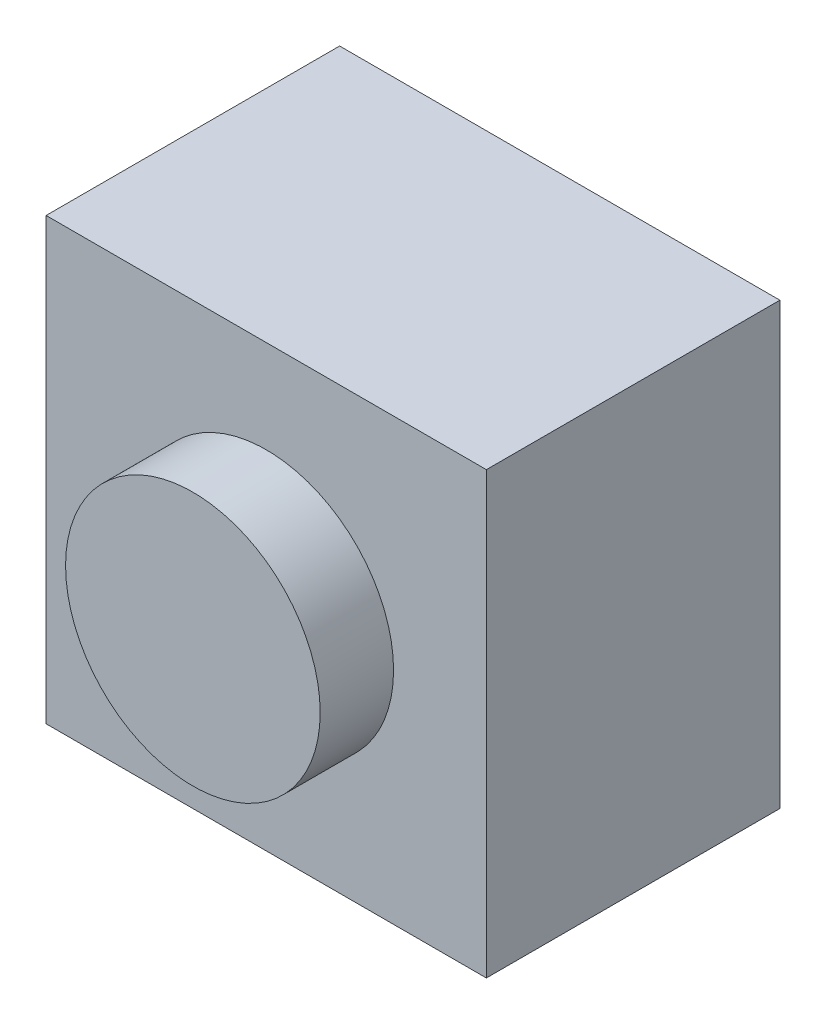
ISO-10303-21;
HEADER;
FILE_DESCRIPTION(('STEP AP214'),'2;1');
FILE_NAME('part.step','',(''),(''),'','','');
FILE_SCHEMA(('AUTOMOTIVE_DESIGN { 1 0 10303 214 1 1 1 1 }'));
ENDSEC;
DATA;
#1=APPLICATION_CONTEXT('core data for automotive mechanical design processes');
#2=APPLICATION_PROTOCOL_DEFINITION('international standard','automotive_design',2000,#1);
#3=PRODUCT_CONTEXT('',#1,'mechanical');
#4=PRODUCT('Part','Part','',(#3));
#5=PRODUCT_RELATED_PRODUCT_CATEGORY('part','',(#4));
#6=PRODUCT_DEFINITION_FORMATION('','',#4);
#7=PRODUCT_DEFINITION_CONTEXT('part definition',#1,'design');
#8=PRODUCT_DEFINITION('design','',#6,#7);
#9=PRODUCT_DEFINITION_SHAPE('','',#8);
#10=(LENGTH_UNIT() NAMED_UNIT(*) SI_UNIT(.MILLI.,.METRE.));
#11=(NAMED_UNIT(*) PLANE_ANGLE_UNIT() SI_UNIT($,.RADIAN.));
#12=(NAMED_UNIT(*) SI_UNIT($,.STERADIAN.) SOLID_ANGLE_UNIT());
#13=UNCERTAINTY_MEASURE_WITH_UNIT(LENGTH_MEASURE(1.E-05),#10,'distance_accuracy_value','');
#14=(GEOMETRIC_REPRESENTATION_CONTEXT(3) GLOBAL_UNCERTAINTY_ASSIGNED_CONTEXT((#13)) GLOBAL_UNIT_ASSIGNED_CONTEXT((#10,
#11,#12)) REPRESENTATION_CONTEXT('',''));
#15=CARTESIAN_POINT('',(0.,0.,0.));
#16=DIRECTION('',(0.,0.,1.));
#17=DIRECTION('',(1.,0.,0.));
#18=AXIS2_PLACEMENT_3D('',#15,#16,#17);
#19=CARTESIAN_POINT('',(3.,3.,4.));
#20=DIRECTION('',(-1.,0.,0.));
#21=DIRECTION('',(0.,-1.,0.));
#22=AXIS2_PLACEMENT_3D('',#19,#20,#21);
#23=PLANE('',#22);
#24=DIRECTION('',(0.,1.,0.));
#25=VECTOR('',#24,1.);
#26=CARTESIAN_POINT('',(3.,3.,0.));
#27=LINE('',#26,#25);
#28=CARTESIAN_POINT('',(3.,-3.,0.));
#29=VERTEX_POINT('',#28);
#30=CARTESIAN_POINT('',(3.,3.,0.));
#31=VERTEX_POINT('',#30);
#32=EDGE_CURVE('E116',#29,#31,#27,.T.);
#33=ORIENTED_EDGE('',*,*,#32,.T.);
#34=DIRECTION('',(0.,0.,-1.));
#35=VECTOR('',#34,1.);
#36=CARTESIAN_POINT('',(3.,3.,4.));
#37=LINE('',#36,#35);
#38=CARTESIAN_POINT('',(3.,3.,4.));
#39=VERTEX_POINT('',#38);
#40=EDGE_CURVE('E48',#39,#31,#37,.T.);
#41=ORIENTED_EDGE('',*,*,#40,.F.);
#42=DIRECTION('',(0.,1.,0.));
#43=VECTOR('',#42,1.);
#44=CARTESIAN_POINT('',(3.,3.,4.));
#45=LINE('',#44,#43);
#46=CARTESIAN_POINT('',(3.,-3.,4.));
#47=VERTEX_POINT('',#46);
#48=EDGE_CURVE('E99',#47,#39,#45,.T.);
#49=ORIENTED_EDGE('',*,*,#48,.F.);
#50=DIRECTION('',(0.,0.,-1.));
#51=VECTOR('',#50,1.);
#52=CARTESIAN_POINT('',(3.,-3.,4.));
#53=LINE('',#52,#51);
#54=EDGE_CURVE('E112',#47,#29,#53,.T.);
#55=ORIENTED_EDGE('',*,*,#54,.T.);
#56=EDGE_LOOP('',(#33,#41,#49,#55));
#57=FACE_BOUND('',#56,.T.);
#58=ADVANCED_FACE('F45',(#57),#23,.F.);
#59=CARTESIAN_POINT('',(-3.,3.,4.));
#60=DIRECTION('',(0.,-1.,0.));
#61=DIRECTION('',(1.,0.,0.));
#62=AXIS2_PLACEMENT_3D('',#59,#60,#61);
#63=PLANE('',#62);
#64=DIRECTION('',(-1.,0.,0.));
#65=VECTOR('',#64,1.);
#66=CARTESIAN_POINT('',(-3.,3.,0.));
#67=LINE('',#66,#65);
#68=CARTESIAN_POINT('',(-3.,3.,0.));
#69=VERTEX_POINT('',#68);
#70=EDGE_CURVE('E105',#31,#69,#67,.T.);
#71=ORIENTED_EDGE('',*,*,#70,.T.);
#72=DIRECTION('',(0.,0.,-1.));
#73=VECTOR('',#72,1.);
#74=CARTESIAN_POINT('',(-3.,3.,4.));
#75=LINE('',#74,#73);
#76=CARTESIAN_POINT('',(-3.,3.,4.));
#77=VERTEX_POINT('',#76);
#78=EDGE_CURVE('E103',#77,#69,#75,.T.);
#79=ORIENTED_EDGE('',*,*,#78,.F.);
#80=DIRECTION('',(-1.,0.,0.));
#81=VECTOR('',#80,1.);
#82=CARTESIAN_POINT('',(-3.,3.,4.));
#83=LINE('',#82,#81);
#84=EDGE_CURVE('E94',#39,#77,#83,.T.);
#85=ORIENTED_EDGE('',*,*,#84,.F.);
#86=ORIENTED_EDGE('',*,*,#40,.T.);
#87=EDGE_LOOP('',(#71,#79,#85,#86));
#88=FACE_BOUND('',#87,.T.);
#89=ADVANCED_FACE('F104',(#88),#63,.F.);
#90=CARTESIAN_POINT('',(-3.,3.,4.));
#91=DIRECTION('',(1.,0.,0.));
#92=DIRECTION('',(0.,1.,0.));
#93=AXIS2_PLACEMENT_3D('',#90,#91,#92);
#94=PLANE('',#93);
#95=DIRECTION('',(0.,-1.,0.));
#96=VECTOR('',#95,1.);
#97=CARTESIAN_POINT('',(-3.,3.,0.));
#98=LINE('',#97,#96);
#99=CARTESIAN_POINT('',(-3.,-3.,0.));
#100=VERTEX_POINT('',#99);
#101=EDGE_CURVE('E80',#69,#100,#98,.T.);
#102=ORIENTED_EDGE('',*,*,#101,.T.);
#103=DIRECTION('',(0.,0.,-1.));
#104=VECTOR('',#103,1.);
#105=CARTESIAN_POINT('',(-3.,-3.,4.));
#106=LINE('',#105,#104);
#107=CARTESIAN_POINT('',(-3.,-3.,4.));
#108=VERTEX_POINT('',#107);
#109=EDGE_CURVE('E107',#108,#100,#106,.T.);
#110=ORIENTED_EDGE('',*,*,#109,.F.);
#111=DIRECTION('',(0.,-1.,0.));
#112=VECTOR('',#111,1.);
#113=CARTESIAN_POINT('',(-3.,3.,4.));
#114=LINE('',#113,#112);
#115=EDGE_CURVE('E97',#77,#108,#114,.T.);
#116=ORIENTED_EDGE('',*,*,#115,.F.);
#117=ORIENTED_EDGE('',*,*,#78,.T.);
#118=EDGE_LOOP('',(#102,#110,#116,#117));
#119=FACE_BOUND('',#118,.T.);
#120=ADVANCED_FACE('F108',(#119),#94,.F.);
#121=CARTESIAN_POINT('',(-3.,-3.,4.));
#122=DIRECTION('',(0.,1.,0.));
#123=DIRECTION('',(0.,0.,1.));
#124=AXIS2_PLACEMENT_3D('',#121,#122,#123);
#125=PLANE('',#124);
#126=DIRECTION('',(1.,0.,0.));
#127=VECTOR('',#126,1.);
#128=CARTESIAN_POINT('',(-3.,-3.,0.));
#129=LINE('',#128,#127);
#130=EDGE_CURVE('E86',#100,#29,#129,.T.);
#131=ORIENTED_EDGE('',*,*,#130,.T.);
#132=ORIENTED_EDGE('',*,*,#54,.F.);
#133=DIRECTION('',(1.,0.,0.));
#134=VECTOR('',#133,1.);
#135=CARTESIAN_POINT('',(-3.,-3.,4.));
#136=LINE('',#135,#134);
#137=EDGE_CURVE('E63',#108,#47,#136,.T.);
#138=ORIENTED_EDGE('',*,*,#137,.F.);
#139=ORIENTED_EDGE('',*,*,#109,.T.);
#140=EDGE_LOOP('',(#131,#132,#138,#139));
#141=FACE_BOUND('',#140,.T.);
#142=ADVANCED_FACE('F130',(#141),#125,.F.);
#143=CARTESIAN_POINT('',(0.,0.,4.));
#144=DIRECTION('',(0.,0.,1.));
#145=DIRECTION('',(1.,0.,0.));
#146=AXIS2_PLACEMENT_3D('',#143,#144,#145);
#147=PLANE('',#146);
#148=CARTESIAN_POINT('',(0.,0.,4.));
#149=DIRECTION('',(0.,0.,1.));
#150=DIRECTION('',(1.,0.,0.));
#151=AXIS2_PLACEMENT_3D('',#148,#149,#150);
#152=CIRCLE('',#151,1.735);
#153=CARTESIAN_POINT('',(1.735,0.,4.));
#154=VERTEX_POINT('',#153);
#155=EDGE_CURVE('E11',#154,#154,#152,.T.);
#156=ORIENTED_EDGE('',*,*,#155,.F.);
#157=EDGE_LOOP('',(#156));
#158=FACE_BOUND('',#157,.T.);
#159=ORIENTED_EDGE('',*,*,#48,.T.);
#160=ORIENTED_EDGE('',*,*,#84,.T.);
#161=ORIENTED_EDGE('',*,*,#115,.T.);
#162=ORIENTED_EDGE('',*,*,#137,.T.);
#163=EDGE_LOOP('',(#159,#160,#161,#162));
#164=FACE_BOUND('',#163,.T.);
#165=ADVANCED_FACE('F95',(#158,#164),#147,.T.);
#166=CARTESIAN_POINT('',(0.,0.,0.));
#167=DIRECTION('',(0.,0.,1.));
#168=DIRECTION('',(1.,0.,0.));
#169=AXIS2_PLACEMENT_3D('',#166,#167,#168);
#170=PLANE('',#169);
#171=ORIENTED_EDGE('',*,*,#32,.F.);
#172=ORIENTED_EDGE('',*,*,#130,.F.);
#173=ORIENTED_EDGE('',*,*,#101,.F.);
#174=ORIENTED_EDGE('',*,*,#70,.F.);
#175=EDGE_LOOP('',(#171,#172,#173,#174));
#176=FACE_BOUND('',#175,.T.);
#177=ADVANCED_FACE('F133',(#176),#170,.F.);
#178=CARTESIAN_POINT('',(0.,0.,5.));
#179=DIRECTION('',(0.,0.,-1.));
#180=DIRECTION('',(-1.,0.,0.));
#181=AXIS2_PLACEMENT_3D('',#178,#179,#180);
#182=CYLINDRICAL_SURFACE('',#181,1.735);
#183=CARTESIAN_POINT('',(0.,0.,5.));
#184=DIRECTION('',(0.,0.,1.));
#185=DIRECTION('',(1.,0.,0.));
#186=AXIS2_PLACEMENT_3D('',#183,#184,#185);
#187=CIRCLE('',#186,1.735);
#188=CARTESIAN_POINT('',(1.735,0.,5.));
#189=VERTEX_POINT('',#188);
#190=EDGE_CURVE('E120',#189,#189,#187,.T.);
#191=ORIENTED_EDGE('',*,*,#190,.F.);
#192=EDGE_LOOP('',(#191));
#193=FACE_BOUND('',#192,.T.);
#194=ORIENTED_EDGE('',*,*,#155,.T.);
#195=EDGE_LOOP('',(#194));
#196=FACE_BOUND('',#195,.T.);
#197=ADVANCED_FACE('F143',(#193,#196),#182,.T.);
#198=CARTESIAN_POINT('',(0.,0.,5.));
#199=DIRECTION('',(0.,0.,1.));
#200=DIRECTION('',(1.,0.,0.));
#201=AXIS2_PLACEMENT_3D('',#198,#199,#200);
#202=PLANE('',#201);
#203=ORIENTED_EDGE('',*,*,#190,.T.);
#204=EDGE_LOOP('',(#203));
#205=FACE_BOUND('',#204,.T.);
#206=ADVANCED_FACE('F141',(#205),#202,.T.);
#207=CLOSED_SHELL('',(#58,#89,#120,#142,#165,#177,#197,#206));
#208=MANIFOLD_SOLID_BREP('B2',#207);
#209=ADVANCED_BREP_SHAPE_REPRESENTATION('',(#18,#208),#14);
#210=SHAPE_DEFINITION_REPRESENTATION(#9,#209);
ENDSEC;
END-ISO-10303-21;
